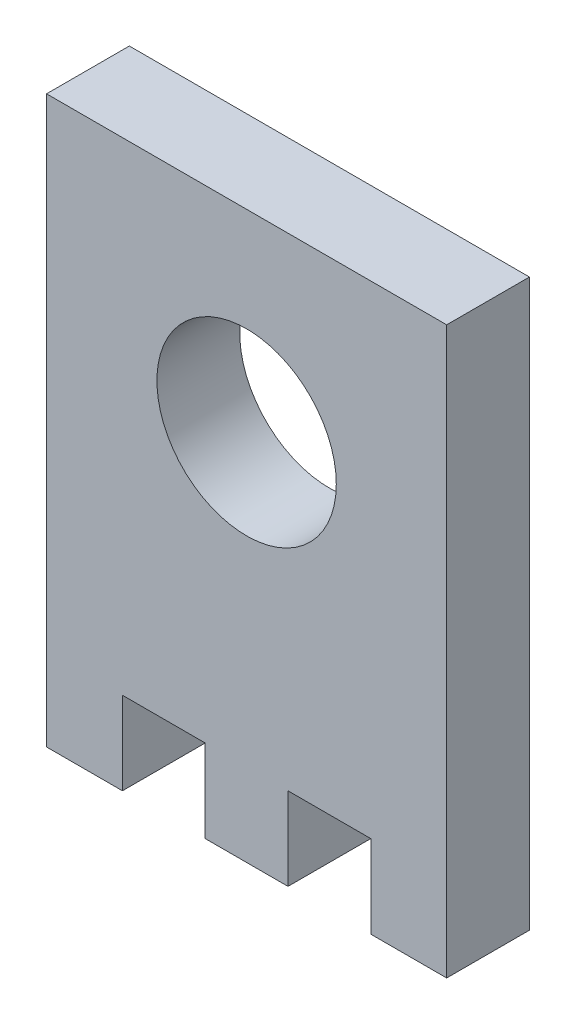
ISO-10303-21;
HEADER;
FILE_DESCRIPTION(('STEP AP214'),'2;1');
FILE_NAME('part.step','',(''),(''),'','','');
FILE_SCHEMA(('AUTOMOTIVE_DESIGN { 1 0 10303 214 1 1 1 1 }'));
ENDSEC;
DATA;
#1=APPLICATION_CONTEXT('core data for automotive mechanical design processes');
#2=APPLICATION_PROTOCOL_DEFINITION('international standard','automotive_design',2000,#1);
#3=PRODUCT_CONTEXT('',#1,'mechanical');
#4=PRODUCT('Part','Part','',(#3));
#5=PRODUCT_RELATED_PRODUCT_CATEGORY('part','',(#4));
#6=PRODUCT_DEFINITION_FORMATION('','',#4);
#7=PRODUCT_DEFINITION_CONTEXT('part definition',#1,'design');
#8=PRODUCT_DEFINITION('design','',#6,#7);
#9=PRODUCT_DEFINITION_SHAPE('','',#8);
#10=(LENGTH_UNIT() NAMED_UNIT(*) SI_UNIT(.MILLI.,.METRE.));
#11=(NAMED_UNIT(*) PLANE_ANGLE_UNIT() SI_UNIT($,.RADIAN.));
#12=(NAMED_UNIT(*) SI_UNIT($,.STERADIAN.) SOLID_ANGLE_UNIT());
#13=UNCERTAINTY_MEASURE_WITH_UNIT(LENGTH_MEASURE(1.E-05),#10,'distance_accuracy_value','');
#14=(GEOMETRIC_REPRESENTATION_CONTEXT(3) GLOBAL_UNCERTAINTY_ASSIGNED_CONTEXT((#13)) GLOBAL_UNIT_ASSIGNED_CONTEXT((#10,
#11,#12)) REPRESENTATION_CONTEXT('',''));
#15=CARTESIAN_POINT('',(0.,0.,0.));
#16=DIRECTION('',(0.,0.,1.));
#17=DIRECTION('',(1.,0.,0.));
#18=AXIS2_PLACEMENT_3D('',#15,#16,#17);
#19=CARTESIAN_POINT('',(0.,0.,3.));
#20=DIRECTION('',(0.,0.,-1.));
#21=DIRECTION('',(-1.,0.,0.));
#22=AXIS2_PLACEMENT_3D('',#19,#20,#21);
#23=PLANE('',#22);
#24=DIRECTION('',(0.,1.,0.));
#25=VECTOR('',#24,1.);
#26=CARTESIAN_POINT('',(18.7452521814818,5.96915699129109,3.));
#27=LINE('',#26,#25);
#28=CARTESIAN_POINT('',(18.7452521814818,5.77825678690954,3.));
#29=VERTEX_POINT('',#28);
#30=CARTESIAN_POINT('',(18.7452521814818,26.2782567869095,3.));
#31=VERTEX_POINT('',#30);
#32=EDGE_CURVE('E54',#29,#31,#27,.T.);
#33=ORIENTED_EDGE('',*,*,#32,.T.);
#34=DIRECTION('',(-1.,0.,0.));
#35=VECTOR('',#34,1.);
#36=CARTESIAN_POINT('',(4.24525218148181,26.2782567869095,3.));
#37=LINE('',#36,#35);
#38=CARTESIAN_POINT('',(4.24525218148181,26.2782567869095,3.));
#39=VERTEX_POINT('',#38);
#40=EDGE_CURVE('E110',#31,#39,#37,.T.);
#41=ORIENTED_EDGE('',*,*,#40,.T.);
#42=DIRECTION('',(0.,-1.,0.));
#43=VECTOR('',#42,1.);
#44=CARTESIAN_POINT('',(4.24525218148181,5.77825678690953,3.));
#45=LINE('',#44,#43);
#46=CARTESIAN_POINT('',(4.24525218148181,5.77825678690953,3.));
#47=VERTEX_POINT('',#46);
#48=EDGE_CURVE('E210',#39,#47,#45,.T.);
#49=ORIENTED_EDGE('',*,*,#48,.T.);
#50=DIRECTION('',(1.,0.,0.));
#51=VECTOR('',#50,1.);
#52=CARTESIAN_POINT('',(4.24525218148181,5.77825678690953,3.));
#53=LINE('',#52,#51);
#54=CARTESIAN_POINT('',(6.99525218148181,5.77825678690954,3.));
#55=VERTEX_POINT('',#54);
#56=EDGE_CURVE('E230',#47,#55,#53,.T.);
#57=ORIENTED_EDGE('',*,*,#56,.T.);
#58=DIRECTION('',(0.,1.,0.));
#59=VECTOR('',#58,1.);
#60=CARTESIAN_POINT('',(6.99525218148181,5.77825678690954,3.));
#61=LINE('',#60,#59);
#62=CARTESIAN_POINT('',(6.99525218148181,8.77825678690954,3.));
#63=VERTEX_POINT('',#62);
#64=EDGE_CURVE('E227',#55,#63,#61,.T.);
#65=ORIENTED_EDGE('',*,*,#64,.T.);
#66=DIRECTION('',(1.,0.,0.));
#67=VECTOR('',#66,1.);
#68=CARTESIAN_POINT('',(6.99525218148181,8.77825678690954,3.));
#69=LINE('',#68,#67);
#70=CARTESIAN_POINT('',(9.99525218148181,8.77825678690954,3.));
#71=VERTEX_POINT('',#70);
#72=EDGE_CURVE('E229',#63,#71,#69,.T.);
#73=ORIENTED_EDGE('',*,*,#72,.T.);
#74=DIRECTION('',(0.,-1.,0.));
#75=VECTOR('',#74,1.);
#76=CARTESIAN_POINT('',(9.99525218148181,5.77825678690954,3.));
#77=LINE('',#76,#75);
#78=CARTESIAN_POINT('',(9.99525218148181,5.77825678690954,3.));
#79=VERTEX_POINT('',#78);
#80=EDGE_CURVE('E232',#71,#79,#77,.T.);
#81=ORIENTED_EDGE('',*,*,#80,.T.);
#82=DIRECTION('',(1.,0.,0.));
#83=VECTOR('',#82,1.);
#84=CARTESIAN_POINT('',(9.99525218148181,5.77825678690954,3.));
#85=LINE('',#84,#83);
#86=CARTESIAN_POINT('',(12.9952521814818,5.77825678690954,3.));
#87=VERTEX_POINT('',#86);
#88=EDGE_CURVE('E238',#79,#87,#85,.T.);
#89=ORIENTED_EDGE('',*,*,#88,.T.);
#90=DIRECTION('',(0.,1.,0.));
#91=VECTOR('',#90,1.);
#92=CARTESIAN_POINT('',(12.9952521814818,5.77825678690954,3.));
#93=LINE('',#92,#91);
#94=CARTESIAN_POINT('',(12.9952521814818,8.77825678690954,3.));
#95=VERTEX_POINT('',#94);
#96=EDGE_CURVE('E142',#87,#95,#93,.T.);
#97=ORIENTED_EDGE('',*,*,#96,.T.);
#98=DIRECTION('',(1.,0.,0.));
#99=VECTOR('',#98,1.);
#100=CARTESIAN_POINT('',(15.9952521814818,8.77825678690954,3.));
#101=LINE('',#100,#99);
#102=CARTESIAN_POINT('',(15.9952521814818,8.77825678690954,3.));
#103=VERTEX_POINT('',#102);
#104=EDGE_CURVE('E136',#95,#103,#101,.T.);
#105=ORIENTED_EDGE('',*,*,#104,.T.);
#106=DIRECTION('',(0.,-1.,0.));
#107=VECTOR('',#106,1.);
#108=CARTESIAN_POINT('',(15.9952521814818,5.77825678690954,3.));
#109=LINE('',#108,#107);
#110=CARTESIAN_POINT('',(15.9952521814818,5.77825678690954,3.));
#111=VERTEX_POINT('',#110);
#112=EDGE_CURVE('E140',#103,#111,#109,.T.);
#113=ORIENTED_EDGE('',*,*,#112,.T.);
#114=DIRECTION('',(1.,0.,0.));
#115=VECTOR('',#114,1.);
#116=CARTESIAN_POINT('',(15.9952521814818,5.77825678690954,3.));
#117=LINE('',#116,#115);
#118=EDGE_CURVE('E156',#111,#29,#117,.T.);
#119=ORIENTED_EDGE('',*,*,#118,.T.);
#120=EDGE_LOOP('',(#33,#41,#49,#57,#65,#73,#81,#89,#97,#105,#113,#119));
#121=FACE_BOUND('',#120,.T.);
#122=CARTESIAN_POINT('',(11.4952521814818,19.2782567869095,3.));
#123=DIRECTION('',(0.,0.,1.));
#124=DIRECTION('',(1.,0.,0.));
#125=AXIS2_PLACEMENT_3D('',#122,#123,#124);
#126=CIRCLE('',#125,3.25);
#127=CARTESIAN_POINT('',(14.7452521814818,19.2782567869095,3.));
#128=VERTEX_POINT('',#127);
#129=EDGE_CURVE('E165',#128,#128,#126,.T.);
#130=ORIENTED_EDGE('',*,*,#129,.F.);
#131=EDGE_LOOP('',(#130));
#132=FACE_BOUND('',#131,.T.);
#133=ADVANCED_FACE('F37',(#121,#132),#23,.F.);
#134=CARTESIAN_POINT('',(0.,0.,0.));
#135=DIRECTION('',(0.,0.,-1.));
#136=DIRECTION('',(-1.,0.,0.));
#137=AXIS2_PLACEMENT_3D('',#134,#135,#136);
#138=PLANE('',#137);
#139=DIRECTION('',(-1.,0.,0.));
#140=VECTOR('',#139,1.);
#141=CARTESIAN_POINT('',(4.24525218148181,26.2782567869095,0.));
#142=LINE('',#141,#140);
#143=CARTESIAN_POINT('',(18.7452521814818,26.2782567869095,0.));
#144=VERTEX_POINT('',#143);
#145=CARTESIAN_POINT('',(4.24525218148181,26.2782567869095,0.));
#146=VERTEX_POINT('',#145);
#147=EDGE_CURVE('E162',#144,#146,#142,.T.);
#148=ORIENTED_EDGE('',*,*,#147,.F.);
#149=DIRECTION('',(0.,1.,0.));
#150=VECTOR('',#149,1.);
#151=CARTESIAN_POINT('',(18.7452521814818,5.96915699129109,0.));
#152=LINE('',#151,#150);
#153=CARTESIAN_POINT('',(18.7452521814818,5.77825678690954,0.));
#154=VERTEX_POINT('',#153);
#155=EDGE_CURVE('E182',#154,#144,#152,.T.);
#156=ORIENTED_EDGE('',*,*,#155,.F.);
#157=DIRECTION('',(1.,0.,0.));
#158=VECTOR('',#157,1.);
#159=CARTESIAN_POINT('',(15.9952521814818,5.77825678690954,0.));
#160=LINE('',#159,#158);
#161=CARTESIAN_POINT('',(15.9952521814818,5.77825678690954,0.));
#162=VERTEX_POINT('',#161);
#163=EDGE_CURVE('E103',#162,#154,#160,.T.);
#164=ORIENTED_EDGE('',*,*,#163,.F.);
#165=DIRECTION('',(0.,-1.,0.));
#166=VECTOR('',#165,1.);
#167=CARTESIAN_POINT('',(15.9952521814818,5.77825678690954,0.));
#168=LINE('',#167,#166);
#169=CARTESIAN_POINT('',(15.9952521814818,8.77825678690954,0.));
#170=VERTEX_POINT('',#169);
#171=EDGE_CURVE('E96',#170,#162,#168,.T.);
#172=ORIENTED_EDGE('',*,*,#171,.F.);
#173=DIRECTION('',(1.,0.,0.));
#174=VECTOR('',#173,1.);
#175=CARTESIAN_POINT('',(15.9952521814818,8.77825678690954,0.));
#176=LINE('',#175,#174);
#177=CARTESIAN_POINT('',(12.9952521814818,8.77825678690954,0.));
#178=VERTEX_POINT('',#177);
#179=EDGE_CURVE('E150',#178,#170,#176,.T.);
#180=ORIENTED_EDGE('',*,*,#179,.F.);
#181=DIRECTION('',(0.,1.,0.));
#182=VECTOR('',#181,1.);
#183=CARTESIAN_POINT('',(12.9952521814818,5.77825678690954,0.));
#184=LINE('',#183,#182);
#185=CARTESIAN_POINT('',(12.9952521814818,5.77825678690954,0.));
#186=VERTEX_POINT('',#185);
#187=EDGE_CURVE('E177',#186,#178,#184,.T.);
#188=ORIENTED_EDGE('',*,*,#187,.F.);
#189=DIRECTION('',(1.,0.,0.));
#190=VECTOR('',#189,1.);
#191=CARTESIAN_POINT('',(9.99525218148181,5.77825678690954,0.));
#192=LINE('',#191,#190);
#193=CARTESIAN_POINT('',(9.99525218148181,5.77825678690954,0.));
#194=VERTEX_POINT('',#193);
#195=EDGE_CURVE('E175',#194,#186,#192,.T.);
#196=ORIENTED_EDGE('',*,*,#195,.F.);
#197=DIRECTION('',(0.,-1.,0.));
#198=VECTOR('',#197,1.);
#199=CARTESIAN_POINT('',(9.99525218148181,5.77825678690954,0.));
#200=LINE('',#199,#198);
#201=CARTESIAN_POINT('',(9.99525218148181,8.77825678690954,0.));
#202=VERTEX_POINT('',#201);
#203=EDGE_CURVE('E173',#202,#194,#200,.T.);
#204=ORIENTED_EDGE('',*,*,#203,.F.);
#205=DIRECTION('',(1.,0.,0.));
#206=VECTOR('',#205,1.);
#207=CARTESIAN_POINT('',(6.99525218148181,8.77825678690954,0.));
#208=LINE('',#207,#206);
#209=CARTESIAN_POINT('',(6.99525218148181,8.77825678690954,0.));
#210=VERTEX_POINT('',#209);
#211=EDGE_CURVE('E171',#210,#202,#208,.T.);
#212=ORIENTED_EDGE('',*,*,#211,.F.);
#213=DIRECTION('',(0.,1.,0.));
#214=VECTOR('',#213,1.);
#215=CARTESIAN_POINT('',(6.99525218148181,5.77825678690954,0.));
#216=LINE('',#215,#214);
#217=CARTESIAN_POINT('',(6.99525218148181,5.77825678690954,0.));
#218=VERTEX_POINT('',#217);
#219=EDGE_CURVE('E169',#218,#210,#216,.T.);
#220=ORIENTED_EDGE('',*,*,#219,.F.);
#221=DIRECTION('',(1.,0.,0.));
#222=VECTOR('',#221,1.);
#223=CARTESIAN_POINT('',(4.24525218148181,5.77825678690953,0.));
#224=LINE('',#223,#222);
#225=CARTESIAN_POINT('',(4.24525218148181,5.77825678690953,0.));
#226=VERTEX_POINT('',#225);
#227=EDGE_CURVE('E167',#226,#218,#224,.T.);
#228=ORIENTED_EDGE('',*,*,#227,.F.);
#229=DIRECTION('',(0.,-1.,0.));
#230=VECTOR('',#229,1.);
#231=CARTESIAN_POINT('',(4.24525218148181,5.77825678690953,0.));
#232=LINE('',#231,#230);
#233=EDGE_CURVE('E164',#146,#226,#232,.T.);
#234=ORIENTED_EDGE('',*,*,#233,.F.);
#235=EDGE_LOOP('',(#148,#156,#164,#172,#180,#188,#196,#204,#212,#220,#228,#234));
#236=FACE_BOUND('',#235,.T.);
#237=CARTESIAN_POINT('',(11.4952521814818,19.2782567869095,0.));
#238=DIRECTION('',(0.,0.,1.));
#239=DIRECTION('',(1.,0.,0.));
#240=AXIS2_PLACEMENT_3D('',#237,#238,#239);
#241=CIRCLE('',#240,3.25);
#242=CARTESIAN_POINT('',(14.7452521814818,19.2782567869095,0.));
#243=VERTEX_POINT('',#242);
#244=EDGE_CURVE('E254',#243,#243,#241,.T.);
#245=ORIENTED_EDGE('',*,*,#244,.T.);
#246=EDGE_LOOP('',(#245));
#247=FACE_BOUND('',#246,.T.);
#248=ADVANCED_FACE('F214',(#236,#247),#138,.T.);
#249=CARTESIAN_POINT('',(4.24525218148181,26.2782567869095,3.));
#250=DIRECTION('',(0.,-1.,0.));
#251=DIRECTION('',(0.,0.,-1.));
#252=AXIS2_PLACEMENT_3D('',#249,#250,#251);
#253=PLANE('',#252);
#254=ORIENTED_EDGE('',*,*,#147,.T.);
#255=DIRECTION('',(0.,0.,-1.));
#256=VECTOR('',#255,1.);
#257=CARTESIAN_POINT('',(4.24525218148181,26.2782567869095,3.));
#258=LINE('',#257,#256);
#259=EDGE_CURVE('E46',#39,#146,#258,.T.);
#260=ORIENTED_EDGE('',*,*,#259,.F.);
#261=ORIENTED_EDGE('',*,*,#40,.F.);
#262=DIRECTION('',(0.,0.,-1.));
#263=VECTOR('',#262,1.);
#264=CARTESIAN_POINT('',(18.7452521814818,26.2782567869095,3.));
#265=LINE('',#264,#263);
#266=EDGE_CURVE('E11',#31,#144,#265,.T.);
#267=ORIENTED_EDGE('',*,*,#266,.T.);
#268=EDGE_LOOP('',(#254,#260,#261,#267));
#269=FACE_BOUND('',#268,.T.);
#270=ADVANCED_FACE('F39',(#269),#253,.F.);
#271=CARTESIAN_POINT('',(4.24525218148181,5.77825678690953,3.));
#272=DIRECTION('',(1.,0.,0.));
#273=DIRECTION('',(0.,0.,-1.));
#274=AXIS2_PLACEMENT_3D('',#271,#272,#273);
#275=PLANE('',#274);
#276=ORIENTED_EDGE('',*,*,#233,.T.);
#277=DIRECTION('',(0.,0.,-1.));
#278=VECTOR('',#277,1.);
#279=CARTESIAN_POINT('',(4.24525218148181,5.77825678690953,3.));
#280=LINE('',#279,#278);
#281=EDGE_CURVE('E202',#47,#226,#280,.T.);
#282=ORIENTED_EDGE('',*,*,#281,.F.);
#283=ORIENTED_EDGE('',*,*,#48,.F.);
#284=ORIENTED_EDGE('',*,*,#259,.T.);
#285=EDGE_LOOP('',(#276,#282,#283,#284));
#286=FACE_BOUND('',#285,.T.);
#287=ADVANCED_FACE('F208',(#286),#275,.F.);
#288=CARTESIAN_POINT('',(4.24525218148181,5.77825678690953,3.));
#289=DIRECTION('',(0.,1.,0.));
#290=DIRECTION('',(-1.,0.,0.));
#291=AXIS2_PLACEMENT_3D('',#288,#289,#290);
#292=PLANE('',#291);
#293=ORIENTED_EDGE('',*,*,#227,.T.);
#294=DIRECTION('',(0.,0.,-1.));
#295=VECTOR('',#294,1.);
#296=CARTESIAN_POINT('',(6.99525218148181,5.77825678690954,3.));
#297=LINE('',#296,#295);
#298=EDGE_CURVE('E199',#55,#218,#297,.T.);
#299=ORIENTED_EDGE('',*,*,#298,.F.);
#300=ORIENTED_EDGE('',*,*,#56,.F.);
#301=ORIENTED_EDGE('',*,*,#281,.T.);
#302=EDGE_LOOP('',(#293,#299,#300,#301));
#303=FACE_BOUND('',#302,.T.);
#304=ADVANCED_FACE('F221',(#303),#292,.F.);
#305=CARTESIAN_POINT('',(6.99525218148181,5.77825678690954,3.));
#306=DIRECTION('',(-1.,0.,0.));
#307=DIRECTION('',(0.,0.,1.));
#308=AXIS2_PLACEMENT_3D('',#305,#306,#307);
#309=PLANE('',#308);
#310=ORIENTED_EDGE('',*,*,#219,.T.);
#311=DIRECTION('',(0.,0.,-1.));
#312=VECTOR('',#311,1.);
#313=CARTESIAN_POINT('',(6.99525218148181,8.77825678690954,3.));
#314=LINE('',#313,#312);
#315=EDGE_CURVE('E196',#63,#210,#314,.T.);
#316=ORIENTED_EDGE('',*,*,#315,.F.);
#317=ORIENTED_EDGE('',*,*,#64,.F.);
#318=ORIENTED_EDGE('',*,*,#298,.T.);
#319=EDGE_LOOP('',(#310,#316,#317,#318));
#320=FACE_BOUND('',#319,.T.);
#321=ADVANCED_FACE('F225',(#320),#309,.F.);
#322=CARTESIAN_POINT('',(6.99525218148181,8.77825678690954,3.));
#323=DIRECTION('',(0.,1.,0.));
#324=DIRECTION('',(0.,0.,1.));
#325=AXIS2_PLACEMENT_3D('',#322,#323,#324);
#326=PLANE('',#325);
#327=ORIENTED_EDGE('',*,*,#211,.T.);
#328=DIRECTION('',(0.,0.,-1.));
#329=VECTOR('',#328,1.);
#330=CARTESIAN_POINT('',(9.99525218148181,8.77825678690954,3.));
#331=LINE('',#330,#329);
#332=EDGE_CURVE('E193',#71,#202,#331,.T.);
#333=ORIENTED_EDGE('',*,*,#332,.F.);
#334=ORIENTED_EDGE('',*,*,#72,.F.);
#335=ORIENTED_EDGE('',*,*,#315,.T.);
#336=EDGE_LOOP('',(#327,#333,#334,#335));
#337=FACE_BOUND('',#336,.T.);
#338=ADVANCED_FACE('F285',(#337),#326,.F.);
#339=CARTESIAN_POINT('',(9.99525218148181,5.77825678690954,3.));
#340=DIRECTION('',(1.,0.,0.));
#341=DIRECTION('',(0.,0.,-1.));
#342=AXIS2_PLACEMENT_3D('',#339,#340,#341);
#343=PLANE('',#342);
#344=ORIENTED_EDGE('',*,*,#203,.T.);
#345=DIRECTION('',(0.,0.,-1.));
#346=VECTOR('',#345,1.);
#347=CARTESIAN_POINT('',(9.99525218148181,5.77825678690954,3.));
#348=LINE('',#347,#346);
#349=EDGE_CURVE('E190',#79,#194,#348,.T.);
#350=ORIENTED_EDGE('',*,*,#349,.F.);
#351=ORIENTED_EDGE('',*,*,#80,.F.);
#352=ORIENTED_EDGE('',*,*,#332,.T.);
#353=EDGE_LOOP('',(#344,#350,#351,#352));
#354=FACE_BOUND('',#353,.T.);
#355=ADVANCED_FACE('F282',(#354),#343,.F.);
#356=CARTESIAN_POINT('',(9.99525218148181,5.77825678690954,3.));
#357=DIRECTION('',(0.,1.,0.));
#358=DIRECTION('',(0.,0.,1.));
#359=AXIS2_PLACEMENT_3D('',#356,#357,#358);
#360=PLANE('',#359);
#361=ORIENTED_EDGE('',*,*,#195,.T.);
#362=DIRECTION('',(0.,0.,-1.));
#363=VECTOR('',#362,1.);
#364=CARTESIAN_POINT('',(12.9952521814818,5.77825678690954,3.));
#365=LINE('',#364,#363);
#366=EDGE_CURVE('E187',#87,#186,#365,.T.);
#367=ORIENTED_EDGE('',*,*,#366,.F.);
#368=ORIENTED_EDGE('',*,*,#88,.F.);
#369=ORIENTED_EDGE('',*,*,#349,.T.);
#370=EDGE_LOOP('',(#361,#367,#368,#369));
#371=FACE_BOUND('',#370,.T.);
#372=ADVANCED_FACE('F244',(#371),#360,.F.);
#373=CARTESIAN_POINT('',(12.9952521814818,5.77825678690954,3.));
#374=DIRECTION('',(-1.,0.,0.));
#375=DIRECTION('',(0.,0.,1.));
#376=AXIS2_PLACEMENT_3D('',#373,#374,#375);
#377=PLANE('',#376);
#378=ORIENTED_EDGE('',*,*,#187,.T.);
#379=DIRECTION('',(0.,0.,-1.));
#380=VECTOR('',#379,1.);
#381=CARTESIAN_POINT('',(12.9952521814818,8.77825678690954,3.));
#382=LINE('',#381,#380);
#383=EDGE_CURVE('E151',#95,#178,#382,.T.);
#384=ORIENTED_EDGE('',*,*,#383,.F.);
#385=ORIENTED_EDGE('',*,*,#96,.F.);
#386=ORIENTED_EDGE('',*,*,#366,.T.);
#387=EDGE_LOOP('',(#378,#384,#385,#386));
#388=FACE_BOUND('',#387,.T.);
#389=ADVANCED_FACE('F248',(#388),#377,.F.);
#390=CARTESIAN_POINT('',(15.9952521814818,8.77825678690954,3.));
#391=DIRECTION('',(0.,1.,0.));
#392=DIRECTION('',(0.,0.,1.));
#393=AXIS2_PLACEMENT_3D('',#390,#391,#392);
#394=PLANE('',#393);
#395=ORIENTED_EDGE('',*,*,#179,.T.);
#396=DIRECTION('',(0.,0.,-1.));
#397=VECTOR('',#396,1.);
#398=CARTESIAN_POINT('',(15.9952521814818,8.77825678690954,3.));
#399=LINE('',#398,#397);
#400=EDGE_CURVE('E147',#103,#170,#399,.T.);
#401=ORIENTED_EDGE('',*,*,#400,.F.);
#402=ORIENTED_EDGE('',*,*,#104,.F.);
#403=ORIENTED_EDGE('',*,*,#383,.T.);
#404=EDGE_LOOP('',(#395,#401,#402,#403));
#405=FACE_BOUND('',#404,.T.);
#406=ADVANCED_FACE('F148',(#405),#394,.F.);
#407=CARTESIAN_POINT('',(15.9952521814818,5.77825678690954,3.));
#408=DIRECTION('',(1.,0.,0.));
#409=DIRECTION('',(0.,0.,-1.));
#410=AXIS2_PLACEMENT_3D('',#407,#408,#409);
#411=PLANE('',#410);
#412=ORIENTED_EDGE('',*,*,#171,.T.);
#413=DIRECTION('',(0.,0.,-1.));
#414=VECTOR('',#413,1.);
#415=CARTESIAN_POINT('',(15.9952521814818,5.77825678690954,3.));
#416=LINE('',#415,#414);
#417=EDGE_CURVE('E152',#111,#162,#416,.T.);
#418=ORIENTED_EDGE('',*,*,#417,.F.);
#419=ORIENTED_EDGE('',*,*,#112,.F.);
#420=ORIENTED_EDGE('',*,*,#400,.T.);
#421=EDGE_LOOP('',(#412,#418,#419,#420));
#422=FACE_BOUND('',#421,.T.);
#423=ADVANCED_FACE('F154',(#422),#411,.F.);
#424=CARTESIAN_POINT('',(15.9952521814818,5.77825678690954,3.));
#425=DIRECTION('',(0.,1.,0.));
#426=DIRECTION('',(0.,0.,1.));
#427=AXIS2_PLACEMENT_3D('',#424,#425,#426);
#428=PLANE('',#427);
#429=ORIENTED_EDGE('',*,*,#163,.T.);
#430=DIRECTION('',(0.,0.,-1.));
#431=VECTOR('',#430,1.);
#432=CARTESIAN_POINT('',(18.7452521814818,5.77825678690954,3.));
#433=LINE('',#432,#431);
#434=EDGE_CURVE('E158',#29,#154,#433,.T.);
#435=ORIENTED_EDGE('',*,*,#434,.F.);
#436=ORIENTED_EDGE('',*,*,#118,.F.);
#437=ORIENTED_EDGE('',*,*,#417,.T.);
#438=EDGE_LOOP('',(#429,#435,#436,#437));
#439=FACE_BOUND('',#438,.T.);
#440=ADVANCED_FACE('F250',(#439),#428,.F.);
#441=CARTESIAN_POINT('',(18.7452521814818,5.96915699129109,3.));
#442=DIRECTION('',(-1.,0.,0.));
#443=DIRECTION('',(0.,0.,1.));
#444=AXIS2_PLACEMENT_3D('',#441,#442,#443);
#445=PLANE('',#444);
#446=ORIENTED_EDGE('',*,*,#155,.T.);
#447=ORIENTED_EDGE('',*,*,#266,.F.);
#448=ORIENTED_EDGE('',*,*,#32,.F.);
#449=ORIENTED_EDGE('',*,*,#434,.T.);
#450=EDGE_LOOP('',(#446,#447,#448,#449));
#451=FACE_BOUND('',#450,.T.);
#452=ADVANCED_FACE('F249',(#451),#445,.F.);
#453=CARTESIAN_POINT('',(11.4952521814818,19.2782567869095,3.));
#454=DIRECTION('',(0.,0.,-1.));
#455=DIRECTION('',(-1.,0.,0.));
#456=AXIS2_PLACEMENT_3D('',#453,#454,#455);
#457=CYLINDRICAL_SURFACE('',#456,3.25);
#458=ORIENTED_EDGE('',*,*,#129,.T.);
#459=EDGE_LOOP('',(#458));
#460=FACE_BOUND('',#459,.T.);
#461=ORIENTED_EDGE('',*,*,#244,.F.);
#462=EDGE_LOOP('',(#461));
#463=FACE_BOUND('',#462,.T.);
#464=ADVANCED_FACE('F260',(#460,#463),#457,.F.);
#465=CLOSED_SHELL('',(#133,#248,#270,#287,#304,#321,#338,#355,#372,#389,#406,#423,#440,#452,#464));
#466=MANIFOLD_SOLID_BREP('B2',#465);
#467=ADVANCED_BREP_SHAPE_REPRESENTATION('',(#18,#466),#14);
#468=SHAPE_DEFINITION_REPRESENTATION(#9,#467);
ENDSEC;
END-ISO-10303-21;
